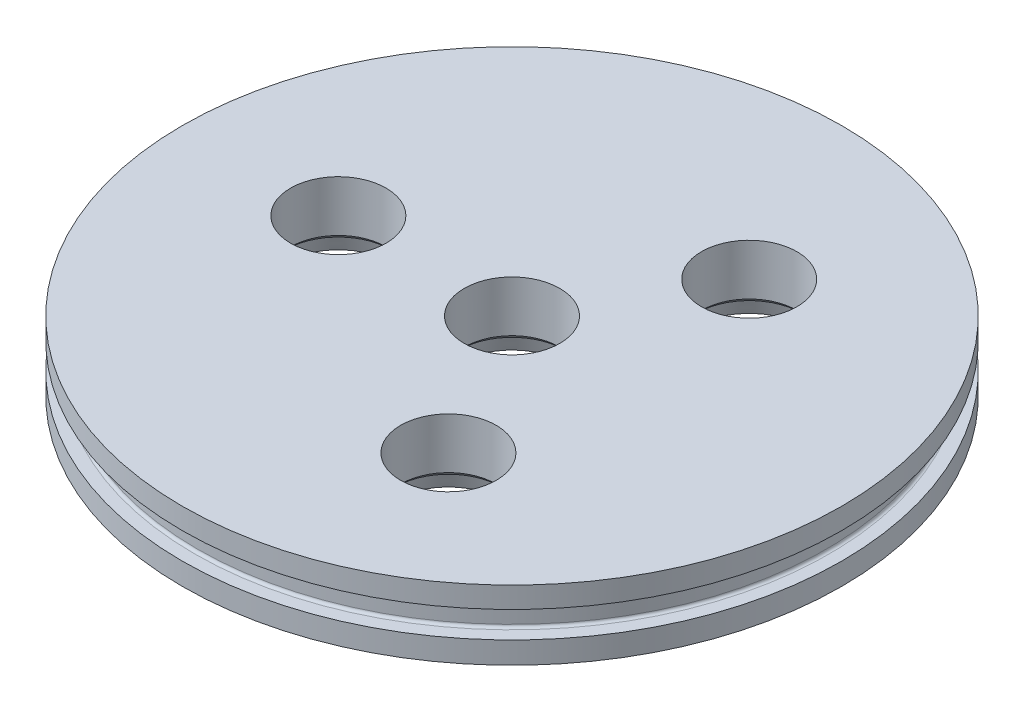
ISO-10303-21;
HEADER;
FILE_DESCRIPTION(('STEP AP214'),'2;1');
FILE_NAME('part.step','',(''),(''),'','','');
FILE_SCHEMA(('AUTOMOTIVE_DESIGN { 1 0 10303 214 1 1 1 1 }'));
ENDSEC;
DATA;
#1=APPLICATION_CONTEXT('core data for automotive mechanical design processes');
#2=APPLICATION_PROTOCOL_DEFINITION('international standard','automotive_design',2000,#1);
#3=PRODUCT_CONTEXT('',#1,'mechanical');
#4=PRODUCT('Part','Part','',(#3));
#5=PRODUCT_RELATED_PRODUCT_CATEGORY('part','',(#4));
#6=PRODUCT_DEFINITION_FORMATION('','',#4);
#7=PRODUCT_DEFINITION_CONTEXT('part definition',#1,'design');
#8=PRODUCT_DEFINITION('design','',#6,#7);
#9=PRODUCT_DEFINITION_SHAPE('','',#8);
#10=(LENGTH_UNIT() NAMED_UNIT(*) SI_UNIT(.MILLI.,.METRE.));
#11=(NAMED_UNIT(*) PLANE_ANGLE_UNIT() SI_UNIT($,.RADIAN.));
#12=(NAMED_UNIT(*) SI_UNIT($,.STERADIAN.) SOLID_ANGLE_UNIT());
#13=UNCERTAINTY_MEASURE_WITH_UNIT(LENGTH_MEASURE(1.E-05),#10,'distance_accuracy_value','');
#14=(GEOMETRIC_REPRESENTATION_CONTEXT(3) GLOBAL_UNCERTAINTY_ASSIGNED_CONTEXT((#13)) GLOBAL_UNIT_ASSIGNED_CONTEXT((#10,
#11,#12)) REPRESENTATION_CONTEXT('',''));
#15=CARTESIAN_POINT('',(0.,0.,0.));
#16=DIRECTION('',(0.,0.,1.));
#17=DIRECTION('',(1.,0.,0.));
#18=AXIS2_PLACEMENT_3D('',#15,#16,#17);
#19=CARTESIAN_POINT('',(0.,12.7,0.));
#20=DIRECTION('',(0.,1.,0.));
#21=DIRECTION('',(0.,0.,1.));
#22=AXIS2_PLACEMENT_3D('',#19,#20,#21);
#23=PLANE('',#22);
#24=CARTESIAN_POINT('',(15.8750000000002,12.7,-27.4963065701558));
#25=DIRECTION('',(0.,1.,0.));
#26=DIRECTION('',(0.,0.,1.));
#27=AXIS2_PLACEMENT_3D('',#24,#25,#26);
#28=CIRCLE('',#27,8.73125);
#29=CARTESIAN_POINT('',(15.8750000000002,12.7,-18.7650565701558));
#30=VERTEX_POINT('',#29);
#31=EDGE_CURVE('E54',#30,#30,#28,.T.);
#32=ORIENTED_EDGE('',*,*,#31,.F.);
#33=EDGE_LOOP('',(#32));
#34=FACE_BOUND('',#33,.T.);
#35=CARTESIAN_POINT('',(-31.75,12.7,-1.21430643318376E-13));
#36=DIRECTION('',(0.,1.,0.));
#37=DIRECTION('',(0.,0.,1.));
#38=AXIS2_PLACEMENT_3D('',#35,#36,#37);
#39=CIRCLE('',#38,8.73125);
#40=CARTESIAN_POINT('',(-31.75,12.7,8.73124999999988));
#41=VERTEX_POINT('',#40);
#42=EDGE_CURVE('E58',#41,#41,#39,.T.);
#43=ORIENTED_EDGE('',*,*,#42,.F.);
#44=EDGE_LOOP('',(#43));
#45=FACE_BOUND('',#44,.T.);
#46=CARTESIAN_POINT('',(15.875,12.7,27.4963065701559));
#47=DIRECTION('',(0.,1.,0.));
#48=DIRECTION('',(0.,0.,1.));
#49=AXIS2_PLACEMENT_3D('',#46,#47,#48);
#50=CIRCLE('',#49,8.73125);
#51=CARTESIAN_POINT('',(15.875,12.7,36.2275565701559));
#52=VERTEX_POINT('',#51);
#53=EDGE_CURVE('E61',#52,#52,#50,.T.);
#54=ORIENTED_EDGE('',*,*,#53,.F.);
#55=EDGE_LOOP('',(#54));
#56=FACE_BOUND('',#55,.T.);
#57=CARTESIAN_POINT('',(0.,12.7,0.));
#58=DIRECTION('',(0.,1.,0.));
#59=DIRECTION('',(0.,0.,1.));
#60=AXIS2_PLACEMENT_3D('',#57,#58,#59);
#61=CIRCLE('',#60,8.73125);
#62=CARTESIAN_POINT('',(0.,12.7,8.73125));
#63=VERTEX_POINT('',#62);
#64=EDGE_CURVE('E64',#63,#63,#61,.T.);
#65=ORIENTED_EDGE('',*,*,#64,.F.);
#66=EDGE_LOOP('',(#65));
#67=FACE_BOUND('',#66,.T.);
#68=CARTESIAN_POINT('',(0.,12.7,0.));
#69=DIRECTION('',(0.,-1.,0.));
#70=DIRECTION('',(0.,0.,-1.));
#71=AXIS2_PLACEMENT_3D('',#68,#69,#70);
#72=CIRCLE('',#71,60.2869);
#73=CARTESIAN_POINT('',(0.,12.7,-60.2869));
#74=VERTEX_POINT('',#73);
#75=EDGE_CURVE('E53',#74,#74,#72,.T.);
#76=ORIENTED_EDGE('',*,*,#75,.F.);
#77=EDGE_LOOP('',(#76));
#78=FACE_BOUND('',#77,.T.);
#79=ADVANCED_FACE('F33',(#34,#45,#56,#67,#78),#23,.T.);
#80=CARTESIAN_POINT('',(0.,0.,0.));
#81=DIRECTION('',(0.,-1.,0.));
#82=DIRECTION('',(0.,0.,-1.));
#83=AXIS2_PLACEMENT_3D('',#80,#81,#82);
#84=CYLINDRICAL_SURFACE('',#83,60.2869);
#85=ORIENTED_EDGE('',*,*,#75,.T.);
#86=EDGE_LOOP('',(#85));
#87=FACE_BOUND('',#86,.T.);
#88=CARTESIAN_POINT('',(0.,8.83464800548341,0.));
#89=DIRECTION('',(0.,-1.,0.));
#90=DIRECTION('',(0.,0.,-1.));
#91=AXIS2_PLACEMENT_3D('',#88,#89,#90);
#92=CIRCLE('',#91,60.2869);
#93=CARTESIAN_POINT('',(0.,8.83464800548341,-60.2869));
#94=VERTEX_POINT('',#93);
#95=EDGE_CURVE('E70',#94,#94,#92,.T.);
#96=ORIENTED_EDGE('',*,*,#95,.F.);
#97=EDGE_LOOP('',(#96));
#98=FACE_BOUND('',#97,.T.);
#99=ADVANCED_FACE('F142',(#87,#98),#84,.T.);
#100=CARTESIAN_POINT('',(57.5056,8.83464800548341,0.));
#101=DIRECTION('',(0.,-1.,0.));
#102=DIRECTION('',(0.,0.,-1.));
#103=AXIS2_PLACEMENT_3D('',#100,#101,#102);
#104=PLANE('',#103);
#105=CARTESIAN_POINT('',(0.,8.83464800548341,0.));
#106=DIRECTION('',(0.,-1.,0.));
#107=DIRECTION('',(0.,0.,-1.));
#108=AXIS2_PLACEMENT_3D('',#105,#106,#107);
#109=CIRCLE('',#108,58.0136);
#110=CARTESIAN_POINT('',(0.,8.83464800548341,-58.0136));
#111=VERTEX_POINT('',#110);
#112=EDGE_CURVE('E10',#111,#111,#109,.F.);
#113=ORIENTED_EDGE('',*,*,#112,.T.);
#114=EDGE_LOOP('',(#113));
#115=FACE_BOUND('',#114,.T.);
#116=ORIENTED_EDGE('',*,*,#95,.T.);
#117=EDGE_LOOP('',(#116));
#118=FACE_BOUND('',#117,.T.);
#119=ADVANCED_FACE('F148',(#115,#118),#104,.T.);
#120=CARTESIAN_POINT('',(0.,0.,0.));
#121=DIRECTION('',(0.,-1.,0.));
#122=DIRECTION('',(0.,0.,-1.));
#123=AXIS2_PLACEMENT_3D('',#120,#121,#122);
#124=CYLINDRICAL_SURFACE('',#123,57.5056);
#125=CARTESIAN_POINT('',(0.,4.51664800548341,0.));
#126=DIRECTION('',(0.,1.,0.));
#127=DIRECTION('',(0.,0.,1.));
#128=AXIS2_PLACEMENT_3D('',#125,#126,#127);
#129=CIRCLE('',#128,57.5056);
#130=CARTESIAN_POINT('',(0.,4.51664800548341,57.5056));
#131=VERTEX_POINT('',#130);
#132=EDGE_CURVE('E40',#131,#131,#129,.T.);
#133=ORIENTED_EDGE('',*,*,#132,.T.);
#134=EDGE_LOOP('',(#133));
#135=FACE_BOUND('',#134,.T.);
#136=CARTESIAN_POINT('',(0.,8.32664800548341,0.));
#137=DIRECTION('',(0.,-1.,0.));
#138=DIRECTION('',(0.,0.,-1.));
#139=AXIS2_PLACEMENT_3D('',#136,#137,#138);
#140=CIRCLE('',#139,57.5056);
#141=CARTESIAN_POINT('',(0.,8.32664800548341,-57.5056));
#142=VERTEX_POINT('',#141);
#143=EDGE_CURVE('E44',#142,#142,#140,.T.);
#144=ORIENTED_EDGE('',*,*,#143,.T.);
#145=EDGE_LOOP('',(#144));
#146=FACE_BOUND('',#145,.T.);
#147=ADVANCED_FACE('F174',(#135,#146),#124,.T.);
#148=CARTESIAN_POINT('',(60.2869,4.00864800548341,0.));
#149=DIRECTION('',(0.,1.,0.));
#150=DIRECTION('',(0.,0.,1.));
#151=AXIS2_PLACEMENT_3D('',#148,#149,#150);
#152=PLANE('',#151);
#153=CARTESIAN_POINT('',(0.,4.00864800548341,0.));
#154=DIRECTION('',(0.,1.,0.));
#155=DIRECTION('',(0.,0.,1.));
#156=AXIS2_PLACEMENT_3D('',#153,#154,#155);
#157=CIRCLE('',#156,58.0136);
#158=CARTESIAN_POINT('',(0.,4.00864800548341,58.0136));
#159=VERTEX_POINT('',#158);
#160=EDGE_CURVE('E48',#159,#159,#157,.F.);
#161=ORIENTED_EDGE('',*,*,#160,.T.);
#162=EDGE_LOOP('',(#161));
#163=FACE_BOUND('',#162,.T.);
#164=CARTESIAN_POINT('',(0.,4.00864800548341,0.));
#165=DIRECTION('',(0.,-1.,0.));
#166=DIRECTION('',(0.,0.,-1.));
#167=AXIS2_PLACEMENT_3D('',#164,#165,#166);
#168=CIRCLE('',#167,60.2869);
#169=CARTESIAN_POINT('',(0.,4.00864800548341,-60.2869));
#170=VERTEX_POINT('',#169);
#171=EDGE_CURVE('E73',#170,#170,#168,.T.);
#172=ORIENTED_EDGE('',*,*,#171,.F.);
#173=EDGE_LOOP('',(#172));
#174=FACE_BOUND('',#173,.T.);
#175=ADVANCED_FACE('F170',(#163,#174),#152,.T.);
#176=CARTESIAN_POINT('',(0.,0.,0.));
#177=DIRECTION('',(0.,-1.,0.));
#178=DIRECTION('',(0.,0.,-1.));
#179=AXIS2_PLACEMENT_3D('',#176,#177,#178);
#180=CYLINDRICAL_SURFACE('',#179,60.2869);
#181=ORIENTED_EDGE('',*,*,#171,.T.);
#182=EDGE_LOOP('',(#181));
#183=FACE_BOUND('',#182,.T.);
#184=CARTESIAN_POINT('',(0.,0.,0.));
#185=DIRECTION('',(0.,-1.,0.));
#186=DIRECTION('',(0.,0.,-1.));
#187=AXIS2_PLACEMENT_3D('',#184,#185,#186);
#188=CIRCLE('',#187,60.2869);
#189=CARTESIAN_POINT('',(0.,0.,-60.2869));
#190=VERTEX_POINT('',#189);
#191=EDGE_CURVE('E57',#190,#190,#188,.T.);
#192=ORIENTED_EDGE('',*,*,#191,.F.);
#193=EDGE_LOOP('',(#192));
#194=FACE_BOUND('',#193,.T.);
#195=ADVANCED_FACE('F173',(#183,#194),#180,.T.);
#196=CARTESIAN_POINT('',(0.,0.,0.));
#197=DIRECTION('',(0.,-1.,0.));
#198=DIRECTION('',(0.,0.,-1.));
#199=AXIS2_PLACEMENT_3D('',#196,#197,#198);
#200=PLANE('',#199);
#201=CARTESIAN_POINT('',(15.8750000000002,0.,-27.4963065701558));
#202=DIRECTION('',(0.,1.,0.));
#203=DIRECTION('',(0.998481780916298,0.,0.0550829663164494));
#204=AXIS2_PLACEMENT_3D('',#201,#202,#203);
#205=CIRCLE('',#204,10.3);
#206=CARTESIAN_POINT('',(26.1593623434381,0.,-26.9289520170963));
#207=VERTEX_POINT('',#206);
#208=EDGE_CURVE('E94',#207,#207,#205,.T.);
#209=ORIENTED_EDGE('',*,*,#208,.T.);
#210=EDGE_LOOP('',(#209));
#211=FACE_BOUND('',#210,.T.);
#212=CARTESIAN_POINT('',(-31.75,0.,-1.21430643318376E-13));
#213=DIRECTION('',(0.,1.,0.));
#214=DIRECTION('',(-0.451537642312305,0.,-0.892252070647665));
#215=AXIS2_PLACEMENT_3D('',#212,#213,#214);
#216=CIRCLE('',#215,10.3);
#217=CARTESIAN_POINT('',(-36.4008377158167,0.,-9.19019632767107));
#218=VERTEX_POINT('',#217);
#219=EDGE_CURVE('E90',#218,#218,#216,.T.);
#220=ORIENTED_EDGE('',*,*,#219,.T.);
#221=EDGE_LOOP('',(#220));
#222=FACE_BOUND('',#221,.T.);
#223=CARTESIAN_POINT('',(15.875,0.,27.4963065701559));
#224=DIRECTION('',(0.,1.,0.));
#225=DIRECTION('',(-0.546944138603989,0.,0.837169104331222));
#226=AXIS2_PLACEMENT_3D('',#223,#224,#225);
#227=CIRCLE('',#226,10.3);
#228=CARTESIAN_POINT('',(10.2414753723789,0.,36.1191483447675));
#229=VERTEX_POINT('',#228);
#230=EDGE_CURVE('E100',#229,#229,#227,.T.);
#231=ORIENTED_EDGE('',*,*,#230,.T.);
#232=EDGE_LOOP('',(#231));
#233=FACE_BOUND('',#232,.T.);
#234=CARTESIAN_POINT('',(0.,0.,0.));
#235=DIRECTION('',(0.,1.,0.));
#236=DIRECTION('',(0.,0.,-1.));
#237=AXIS2_PLACEMENT_3D('',#234,#235,#236);
#238=CIRCLE('',#237,10.3);
#239=CARTESIAN_POINT('',(0.,0.,-10.3));
#240=VERTEX_POINT('',#239);
#241=EDGE_CURVE('E83',#240,#240,#238,.T.);
#242=ORIENTED_EDGE('',*,*,#241,.T.);
#243=EDGE_LOOP('',(#242));
#244=FACE_BOUND('',#243,.T.);
#245=ORIENTED_EDGE('',*,*,#191,.T.);
#246=EDGE_LOOP('',(#245));
#247=FACE_BOUND('',#246,.T.);
#248=ADVANCED_FACE('F114',(#211,#222,#233,#244,#247),#200,.T.);
#249=CARTESIAN_POINT('',(0.,16.3,0.));
#250=DIRECTION('',(0.,1.,0.));
#251=DIRECTION('',(0.,0.,-1.));
#252=AXIS2_PLACEMENT_3D('',#249,#250,#251);
#253=CYLINDRICAL_SURFACE('',#252,8.73125);
#254=ORIENTED_EDGE('',*,*,#64,.T.);
#255=EDGE_LOOP('',(#254));
#256=FACE_BOUND('',#255,.T.);
#257=CARTESIAN_POINT('',(0.,3.39887701892219,0.));
#258=DIRECTION('',(0.,1.,0.));
#259=DIRECTION('',(0.,0.,-1.));
#260=AXIS2_PLACEMENT_3D('',#257,#258,#259);
#261=CIRCLE('',#260,8.73125);
#262=CARTESIAN_POINT('',(0.,3.39887701892219,-8.73125));
#263=VERTEX_POINT('',#262);
#264=EDGE_CURVE('E67',#263,#263,#261,.T.);
#265=ORIENTED_EDGE('',*,*,#264,.F.);
#266=EDGE_LOOP('',(#265));
#267=FACE_BOUND('',#266,.T.);
#268=ADVANCED_FACE('F183',(#256,#267),#253,.F.);
#269=CARTESIAN_POINT('',(0.,3.39887701892219,0.));
#270=DIRECTION('',(0.,-1.,0.));
#271=DIRECTION('',(0.,0.,1.));
#272=AXIS2_PLACEMENT_3D('',#269,#270,#271);
#273=CONICAL_SURFACE('',#272,8.73125,0.78539816339745);
#274=CARTESIAN_POINT('',(0.,2.5,0.));
#275=DIRECTION('',(0.,1.,0.));
#276=DIRECTION('',(0.,0.,-1.));
#277=AXIS2_PLACEMENT_3D('',#274,#275,#276);
#278=CIRCLE('',#277,9.63012701892219);
#279=CARTESIAN_POINT('',(0.,2.5,-9.63012701892219));
#280=VERTEX_POINT('',#279);
#281=EDGE_CURVE('E80',#280,#280,#278,.T.);
#282=ORIENTED_EDGE('',*,*,#281,.F.);
#283=EDGE_LOOP('',(#282));
#284=FACE_BOUND('',#283,.T.);
#285=ORIENTED_EDGE('',*,*,#264,.T.);
#286=EDGE_LOOP('',(#285));
#287=FACE_BOUND('',#286,.T.);
#288=ADVANCED_FACE('F137',(#284,#287),#273,.F.);
#289=CARTESIAN_POINT('',(0.,2.5,0.));
#290=DIRECTION('',(0.,-1.,0.));
#291=DIRECTION('',(0.,0.,1.));
#292=AXIS2_PLACEMENT_3D('',#289,#290,#291);
#293=CONICAL_SURFACE('',#292,9.63012701892219,0.26179938779915);
#294=ORIENTED_EDGE('',*,*,#241,.F.);
#295=EDGE_LOOP('',(#294));
#296=FACE_BOUND('',#295,.T.);
#297=ORIENTED_EDGE('',*,*,#281,.T.);
#298=EDGE_LOOP('',(#297));
#299=FACE_BOUND('',#298,.T.);
#300=ADVANCED_FACE('F132',(#296,#299),#293,.F.);
#301=CARTESIAN_POINT('',(15.875,16.3,27.4963065701559));
#302=DIRECTION('',(0.,1.,0.));
#303=DIRECTION('',(-0.546944138603989,0.,0.837169104331222));
#304=AXIS2_PLACEMENT_3D('',#301,#302,#303);
#305=CYLINDRICAL_SURFACE('',#304,8.73125);
#306=ORIENTED_EDGE('',*,*,#53,.T.);
#307=EDGE_LOOP('',(#306));
#308=FACE_BOUND('',#307,.T.);
#309=CARTESIAN_POINT('',(15.875,3.39887701892219,27.4963065701559));
#310=DIRECTION('',(0.,1.,0.));
#311=DIRECTION('',(-0.546944138603989,0.,0.837169104331222));
#312=AXIS2_PLACEMENT_3D('',#309,#310,#311);
#313=CIRCLE('',#312,8.73125);
#314=CARTESIAN_POINT('',(11.0994939898139,3.39887701892219,34.8058393123479));
#315=VERTEX_POINT('',#314);
#316=EDGE_CURVE('E86',#315,#315,#313,.T.);
#317=ORIENTED_EDGE('',*,*,#316,.F.);
#318=EDGE_LOOP('',(#317));
#319=FACE_BOUND('',#318,.T.);
#320=ADVANCED_FACE('F127',(#308,#319),#305,.F.);
#321=CARTESIAN_POINT('',(15.875,3.39887701892219,27.4963065701559));
#322=DIRECTION('',(0.,-1.,0.));
#323=DIRECTION('',(0.546944138603989,0.,-0.837169104331222));
#324=AXIS2_PLACEMENT_3D('',#321,#322,#323);
#325=CONICAL_SURFACE('',#324,8.73125,0.78539816339745);
#326=CARTESIAN_POINT('',(15.875,2.5,27.4963065701559));
#327=DIRECTION('',(0.,1.,0.));
#328=DIRECTION('',(-0.546944138603989,0.,0.837169104331222));
#329=AXIS2_PLACEMENT_3D('',#326,#327,#328);
#330=CIRCLE('',#329,9.63012701892219);
#331=CARTESIAN_POINT('',(10.6078584729886,2.5,35.5583513811829));
#332=VERTEX_POINT('',#331);
#333=EDGE_CURVE('E108',#332,#332,#330,.T.);
#334=ORIENTED_EDGE('',*,*,#333,.F.);
#335=EDGE_LOOP('',(#334));
#336=FACE_BOUND('',#335,.T.);
#337=ORIENTED_EDGE('',*,*,#316,.T.);
#338=EDGE_LOOP('',(#337));
#339=FACE_BOUND('',#338,.T.);
#340=ADVANCED_FACE('F121',(#336,#339),#325,.F.);
#341=CARTESIAN_POINT('',(15.875,2.5,27.4963065701559));
#342=DIRECTION('',(0.,-1.,0.));
#343=DIRECTION('',(0.546944138603989,0.,-0.837169104331222));
#344=AXIS2_PLACEMENT_3D('',#341,#342,#343);
#345=CONICAL_SURFACE('',#344,9.63012701892219,0.26179938779915);
#346=ORIENTED_EDGE('',*,*,#230,.F.);
#347=EDGE_LOOP('',(#346));
#348=FACE_BOUND('',#347,.T.);
#349=ORIENTED_EDGE('',*,*,#333,.T.);
#350=EDGE_LOOP('',(#349));
#351=FACE_BOUND('',#350,.T.);
#352=ADVANCED_FACE('F117',(#348,#351),#345,.F.);
#353=CARTESIAN_POINT('',(-31.75,16.3,-1.21430643318376E-13));
#354=DIRECTION('',(0.,1.,0.));
#355=DIRECTION('',(-0.451537642312305,0.,-0.892252070647665));
#356=AXIS2_PLACEMENT_3D('',#353,#354,#355);
#357=CYLINDRICAL_SURFACE('',#356,8.73125);
#358=ORIENTED_EDGE('',*,*,#42,.T.);
#359=EDGE_LOOP('',(#358));
#360=FACE_BOUND('',#359,.T.);
#361=CARTESIAN_POINT('',(-31.75,3.39887701892219,-1.21430643318376E-13));
#362=DIRECTION('',(0.,1.,0.));
#363=DIRECTION('',(-0.451537642312305,0.,-0.892252070647665));
#364=AXIS2_PLACEMENT_3D('',#361,#362,#363);
#365=CIRCLE('',#364,8.73125);
#366=CARTESIAN_POINT('',(-35.6924880394393,3.39887701892219,-7.79047589184254));
#367=VERTEX_POINT('',#366);
#368=EDGE_CURVE('E97',#367,#367,#365,.T.);
#369=ORIENTED_EDGE('',*,*,#368,.F.);
#370=EDGE_LOOP('',(#369));
#371=FACE_BOUND('',#370,.T.);
#372=ADVANCED_FACE('F120',(#360,#371),#357,.F.);
#373=CARTESIAN_POINT('',(-31.75,3.39887701892219,-1.21430643318376E-13));
#374=DIRECTION('',(0.,-1.,0.));
#375=DIRECTION('',(0.451537642312305,0.,0.892252070647665));
#376=AXIS2_PLACEMENT_3D('',#373,#374,#375);
#377=CONICAL_SURFACE('',#376,8.73125,0.78539816339745);
#378=CARTESIAN_POINT('',(-31.75,2.5,-1.21430643318376E-13));
#379=DIRECTION('',(0.,1.,0.));
#380=DIRECTION('',(-0.451537642312305,0.,-0.892252070647665));
#381=AXIS2_PLACEMENT_3D('',#378,#379,#380);
#382=CIRCLE('',#381,9.63012701892219);
#383=CARTESIAN_POINT('',(-36.0983648492921,2.5,-8.59250077323347));
#384=VERTEX_POINT('',#383);
#385=EDGE_CURVE('E101',#384,#384,#382,.T.);
#386=ORIENTED_EDGE('',*,*,#385,.F.);
#387=EDGE_LOOP('',(#386));
#388=FACE_BOUND('',#387,.T.);
#389=ORIENTED_EDGE('',*,*,#368,.T.);
#390=EDGE_LOOP('',(#389));
#391=FACE_BOUND('',#390,.T.);
#392=ADVANCED_FACE('F264',(#388,#391),#377,.F.);
#393=CARTESIAN_POINT('',(-31.75,2.5,-1.21430643318376E-13));
#394=DIRECTION('',(0.,-1.,0.));
#395=DIRECTION('',(0.451537642312305,0.,0.892252070647665));
#396=AXIS2_PLACEMENT_3D('',#393,#394,#395);
#397=CONICAL_SURFACE('',#396,9.63012701892219,0.26179938779915);
#398=ORIENTED_EDGE('',*,*,#219,.F.);
#399=EDGE_LOOP('',(#398));
#400=FACE_BOUND('',#399,.T.);
#401=ORIENTED_EDGE('',*,*,#385,.T.);
#402=EDGE_LOOP('',(#401));
#403=FACE_BOUND('',#402,.T.);
#404=ADVANCED_FACE('F252',(#400,#403),#397,.F.);
#405=CARTESIAN_POINT('',(15.8750000000002,16.3,-27.4963065701558));
#406=DIRECTION('',(0.,1.,0.));
#407=DIRECTION('',(0.998481780916298,0.,0.0550829663164494));
#408=AXIS2_PLACEMENT_3D('',#405,#406,#407);
#409=CYLINDRICAL_SURFACE('',#408,8.73125);
#410=ORIENTED_EDGE('',*,*,#31,.T.);
#411=EDGE_LOOP('',(#410));
#412=FACE_BOUND('',#411,.T.);
#413=CARTESIAN_POINT('',(15.8750000000002,3.39887701892219,-27.4963065701558));
#414=DIRECTION('',(0.,1.,0.));
#415=DIRECTION('',(0.998481780916298,0.,0.0550829663164494));
#416=AXIS2_PLACEMENT_3D('',#413,#414,#415);
#417=CIRCLE('',#416,8.73125);
#418=CARTESIAN_POINT('',(24.5929940496257,3.39887701892219,-27.0153634205053));
#419=VERTEX_POINT('',#418);
#420=EDGE_CURVE('E87',#419,#419,#417,.T.);
#421=ORIENTED_EDGE('',*,*,#420,.F.);
#422=EDGE_LOOP('',(#421));
#423=FACE_BOUND('',#422,.T.);
#424=ADVANCED_FACE('F241',(#412,#423),#409,.F.);
#425=CARTESIAN_POINT('',(15.8750000000002,3.39887701892219,-27.4963065701558));
#426=DIRECTION('',(0.,-1.,0.));
#427=DIRECTION('',(-0.998481780916298,0.,-0.0550829663164494));
#428=AXIS2_PLACEMENT_3D('',#425,#426,#427);
#429=CONICAL_SURFACE('',#428,8.73125,0.78539816339745);
#430=CARTESIAN_POINT('',(15.8750000000002,2.5,-27.4963065701558));
#431=DIRECTION('',(0.,1.,0.));
#432=DIRECTION('',(0.998481780916298,0.,0.0550829663164494));
#433=AXIS2_PLACEMENT_3D('',#430,#431,#432);
#434=CIRCLE('',#433,9.63012701892219);
#435=CARTESIAN_POINT('',(25.4905063763038,2.5,-26.9658506079494));
#436=VERTEX_POINT('',#435);
#437=EDGE_CURVE('E91',#436,#436,#434,.T.);
#438=ORIENTED_EDGE('',*,*,#437,.F.);
#439=EDGE_LOOP('',(#438));
#440=FACE_BOUND('',#439,.T.);
#441=ORIENTED_EDGE('',*,*,#420,.T.);
#442=EDGE_LOOP('',(#441));
#443=FACE_BOUND('',#442,.T.);
#444=ADVANCED_FACE('F164',(#440,#443),#429,.F.);
#445=CARTESIAN_POINT('',(15.8750000000002,2.5,-27.4963065701558));
#446=DIRECTION('',(0.,-1.,0.));
#447=DIRECTION('',(-0.998481780916298,0.,-0.0550829663164494));
#448=AXIS2_PLACEMENT_3D('',#445,#446,#447);
#449=CONICAL_SURFACE('',#448,9.63012701892219,0.26179938779915);
#450=ORIENTED_EDGE('',*,*,#208,.F.);
#451=EDGE_LOOP('',(#450));
#452=FACE_BOUND('',#451,.T.);
#453=ORIENTED_EDGE('',*,*,#437,.T.);
#454=EDGE_LOOP('',(#453));
#455=FACE_BOUND('',#454,.T.);
#456=ADVANCED_FACE('F156',(#452,#455),#449,.F.);
#457=CARTESIAN_POINT('',(0.,4.51664800548341,0.));
#458=DIRECTION('',(0.,1.,0.));
#459=DIRECTION('',(0.,0.,1.));
#460=AXIS2_PLACEMENT_3D('',#457,#458,#459);
#461=TOROIDAL_SURFACE('',#460,58.0136,0.508);
#462=ORIENTED_EDGE('',*,*,#132,.F.);
#463=EDGE_LOOP('',(#462));
#464=FACE_BOUND('',#463,.T.);
#465=ORIENTED_EDGE('',*,*,#160,.F.);
#466=EDGE_LOOP('',(#465));
#467=FACE_BOUND('',#466,.T.);
#468=ADVANCED_FACE('F154',(#464,#467),#461,.F.);
#469=CARTESIAN_POINT('',(0.,8.32664800548341,0.));
#470=DIRECTION('',(0.,-1.,0.));
#471=DIRECTION('',(0.,0.,-1.));
#472=AXIS2_PLACEMENT_3D('',#469,#470,#471);
#473=TOROIDAL_SURFACE('',#472,58.0136,0.508);
#474=ORIENTED_EDGE('',*,*,#112,.F.);
#475=EDGE_LOOP('',(#474));
#476=FACE_BOUND('',#475,.T.);
#477=ORIENTED_EDGE('',*,*,#143,.F.);
#478=EDGE_LOOP('',(#477));
#479=FACE_BOUND('',#478,.T.);
#480=ADVANCED_FACE('F35',(#476,#479),#473,.F.);
#481=CLOSED_SHELL('',(#79,#99,#119,#147,#175,#195,#248,#268,#288,#300,#320,#340,#352,#372,#392,
#404,#424,#444,#456,#468,#480));
#482=MANIFOLD_SOLID_BREP('B2',#481);
#483=ADVANCED_BREP_SHAPE_REPRESENTATION('',(#18,#482),#14);
#484=SHAPE_DEFINITION_REPRESENTATION(#9,#483);
ENDSEC;
END-ISO-10303-21;
